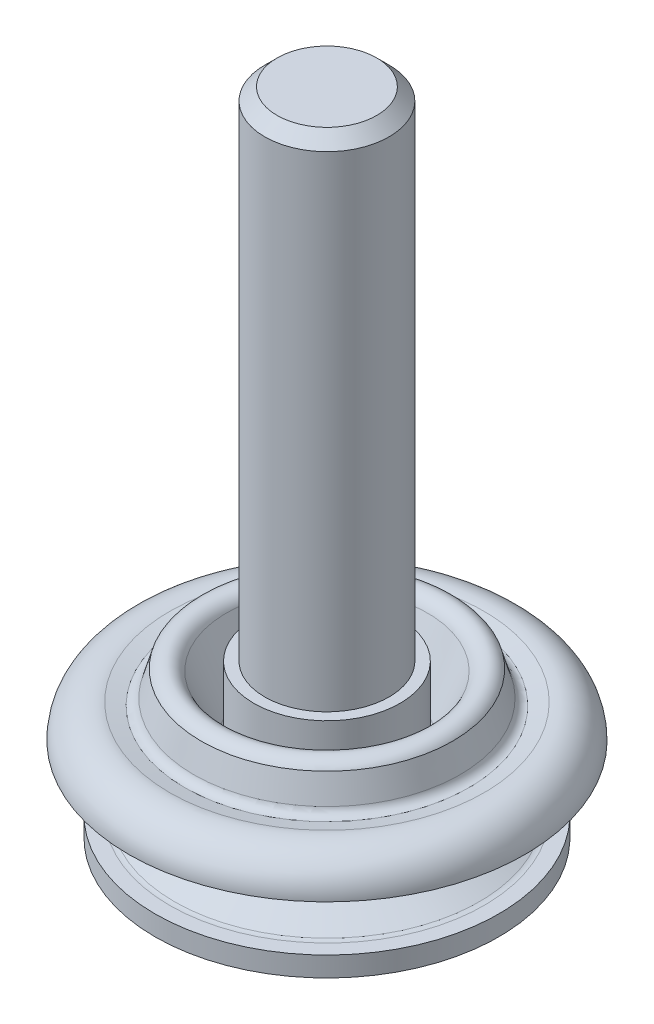
ISO-10303-21;
HEADER;
FILE_DESCRIPTION(('STEP AP214'),'2;1');
FILE_NAME('part.step','',(''),(''),'','','');
FILE_SCHEMA(('AUTOMOTIVE_DESIGN { 1 0 10303 214 1 1 1 1 }'));
ENDSEC;
DATA;
#1=APPLICATION_CONTEXT('core data for automotive mechanical design processes');
#2=APPLICATION_PROTOCOL_DEFINITION('international standard','automotive_design',2000,#1);
#3=PRODUCT_CONTEXT('',#1,'mechanical');
#4=PRODUCT('Part','Part','',(#3));
#5=PRODUCT_RELATED_PRODUCT_CATEGORY('part','',(#4));
#6=PRODUCT_DEFINITION_FORMATION('','',#4);
#7=PRODUCT_DEFINITION_CONTEXT('part definition',#1,'design');
#8=PRODUCT_DEFINITION('design','',#6,#7);
#9=PRODUCT_DEFINITION_SHAPE('','',#8);
#10=(LENGTH_UNIT() NAMED_UNIT(*) SI_UNIT(.MILLI.,.METRE.));
#11=(NAMED_UNIT(*) PLANE_ANGLE_UNIT() SI_UNIT($,.RADIAN.));
#12=(NAMED_UNIT(*) SI_UNIT($,.STERADIAN.) SOLID_ANGLE_UNIT());
#13=UNCERTAINTY_MEASURE_WITH_UNIT(LENGTH_MEASURE(1.E-05),#10,'distance_accuracy_value','');
#14=(GEOMETRIC_REPRESENTATION_CONTEXT(3) GLOBAL_UNCERTAINTY_ASSIGNED_CONTEXT((#13)) GLOBAL_UNIT_ASSIGNED_CONTEXT((#10,
#11,#12)) REPRESENTATION_CONTEXT('',''));
#15=CARTESIAN_POINT('',(0.,0.,0.));
#16=DIRECTION('',(0.,0.,1.));
#17=DIRECTION('',(1.,0.,0.));
#18=AXIS2_PLACEMENT_3D('',#15,#16,#17);
#19=CARTESIAN_POINT('',(-10.8805326439287,24.7146937341376,0.319361058));
#20=DIRECTION('',(0.,-1.,0.));
#21=DIRECTION('',(0.,0.,-1.));
#22=AXIS2_PLACEMENT_3D('',#19,#20,#21);
#23=CONICAL_SURFACE('',#22,4.76577553828,0.56627487324335);
#24=CARTESIAN_POINT('',(-10.8805326439287,23.307110222726,0.319361058));
#25=DIRECTION('',(0.,1.,0.));
#26=DIRECTION('',(0.,0.,1.));
#27=AXIS2_PLACEMENT_3D('',#24,#25,#26);
#28=CIRCLE('',#27,5.66061225);
#29=CARTESIAN_POINT('',(-10.8805326439287,23.307110222726,5.979973308));
#30=VERTEX_POINT('',#29);
#31=EDGE_CURVE('E131',#30,#30,#28,.T.);
#32=ORIENTED_EDGE('',*,*,#31,.T.);
#33=EDGE_LOOP('',(#32));
#34=FACE_BOUND('',#33,.T.);
#35=CARTESIAN_POINT('',(-10.8805326439287,24.7146937341376,0.319361058));
#36=DIRECTION('',(0.,1.,0.));
#37=DIRECTION('',(0.,0.,1.));
#38=AXIS2_PLACEMENT_3D('',#35,#36,#37);
#39=CIRCLE('',#38,4.76577553828);
#40=CARTESIAN_POINT('',(-10.8805326439287,24.7146937341376,5.08513659628));
#41=VERTEX_POINT('',#40);
#42=EDGE_CURVE('E10',#41,#41,#39,.T.);
#43=ORIENTED_EDGE('',*,*,#42,.F.);
#44=EDGE_LOOP('',(#43));
#45=FACE_BOUND('',#44,.T.);
#46=ADVANCED_FACE('F31',(#34,#45),#23,.T.);
#47=CARTESIAN_POINT('',(-10.8805326439287,24.2118454998702,0.319361058));
#48=DIRECTION('',(0.,1.,0.));
#49=DIRECTION('',(0.,0.,1.));
#50=AXIS2_PLACEMENT_3D('',#47,#48,#49);
#51=TOROIDAL_SURFACE('',#50,4.83794155859002,0.508000276764841);
#52=ORIENTED_EDGE('',*,*,#42,.T.);
#53=EDGE_LOOP('',(#52));
#54=FACE_BOUND('',#53,.T.);
#55=CARTESIAN_POINT('',(-10.8805326439287,24.3064292070117,0.319361058));
#56=DIRECTION('',(0.,1.,0.));
#57=DIRECTION('',(0.,0.,1.));
#58=AXIS2_PLACEMENT_3D('',#55,#56,#57);
#59=CIRCLE('',#58,5.33705898318721);
#60=CARTESIAN_POINT('',(-10.8805326439287,24.3064292070117,5.65642004118721));
#61=VERTEX_POINT('',#60);
#62=EDGE_CURVE('E37',#61,#61,#59,.T.);
#63=ORIENTED_EDGE('',*,*,#62,.F.);
#64=EDGE_LOOP('',(#63));
#65=FACE_BOUND('',#64,.T.);
#66=ADVANCED_FACE('F148',(#54,#65),#51,.F.);
#67=CARTESIAN_POINT('',(-10.8805326439287,24.7084096952689,0.319361058));
#68=DIRECTION('',(0.,1.,0.));
#69=DIRECTION('',(0.,0.,1.));
#70=AXIS2_PLACEMENT_3D('',#67,#68,#69);
#71=TOROIDAL_SURFACE('',#70,7.45830662827207,2.15899974171317);
#72=ORIENTED_EDGE('',*,*,#62,.T.);
#73=EDGE_LOOP('',(#72));
#74=FACE_BOUND('',#73,.T.);
#75=CARTESIAN_POINT('',(-10.8805326439287,22.7582847673011,0.319361058));
#76=DIRECTION('',(0.,1.,0.));
#77=DIRECTION('',(0.,0.,1.));
#78=AXIS2_PLACEMENT_3D('',#75,#76,#77);
#79=CIRCLE('',#78,6.53186577746926);
#80=CARTESIAN_POINT('',(-10.8805326439287,22.7582847673011,6.85122683546926));
#81=VERTEX_POINT('',#80);
#82=EDGE_CURVE('E41',#81,#81,#79,.T.);
#83=ORIENTED_EDGE('',*,*,#82,.F.);
#84=EDGE_LOOP('',(#83));
#85=FACE_BOUND('',#84,.T.);
#86=ADVANCED_FACE('F152',(#74,#85),#71,.T.);
#87=CARTESIAN_POINT('',(-10.8805326439287,20.5415673849615,0.319361058));
#88=DIRECTION('',(0.,-1.,0.));
#89=DIRECTION('',(0.,0.,-1.));
#90=AXIS2_PLACEMENT_3D('',#87,#88,#89);
#91=CONICAL_SURFACE('',#90,11.1979767567227,1.12729296950659);
#92=ORIENTED_EDGE('',*,*,#82,.T.);
#93=EDGE_LOOP('',(#92));
#94=FACE_BOUND('',#93,.T.);
#95=CARTESIAN_POINT('',(-10.8805326439287,20.5415673849615,0.319361058));
#96=DIRECTION('',(0.,1.,0.));
#97=DIRECTION('',(0.,0.,1.));
#98=AXIS2_PLACEMENT_3D('',#95,#96,#97);
#99=CIRCLE('',#98,11.1979767567227);
#100=CARTESIAN_POINT('',(-10.8805326439287,20.5415673849615,11.5173378147227));
#101=VERTEX_POINT('',#100);
#102=EDGE_CURVE('E45',#101,#101,#99,.T.);
#103=ORIENTED_EDGE('',*,*,#102,.F.);
#104=EDGE_LOOP('',(#103));
#105=FACE_BOUND('',#104,.T.);
#106=ADVANCED_FACE('F156',(#94,#105),#91,.F.);
#107=CARTESIAN_POINT('',(-10.8805326439287,21.6886998772554,0.319361058));
#108=DIRECTION('',(0.,1.,0.));
#109=DIRECTION('',(0.,0.,1.));
#110=AXIS2_PLACEMENT_3D('',#107,#108,#109);
#111=TOROIDAL_SURFACE('',#110,11.7429420494087,1.27000004925541);
#112=ORIENTED_EDGE('',*,*,#102,.T.);
#113=EDGE_LOOP('',(#112));
#114=FACE_BOUND('',#113,.T.);
#115=CARTESIAN_POINT('',(-10.8805326439287,20.418699828,0.319361058));
#116=DIRECTION('',(0.,1.,0.));
#117=DIRECTION('',(0.,0.,1.));
#118=AXIS2_PLACEMENT_3D('',#115,#116,#117);
#119=CIRCLE('',#118,11.7429420494087);
#120=CARTESIAN_POINT('',(-10.8805326439287,20.418699828,12.0623031074087));
#121=VERTEX_POINT('',#120);
#122=EDGE_CURVE('E50',#121,#121,#119,.T.);
#123=ORIENTED_EDGE('',*,*,#122,.F.);
#124=EDGE_LOOP('',(#123));
#125=FACE_BOUND('',#124,.T.);
#126=ADVANCED_FACE('F162',(#114,#125),#111,.T.);
#127=CARTESIAN_POINT('',(2.280702576,20.418699828,0.319361058));
#128=DIRECTION('',(0.,-1.,0.));
#129=DIRECTION('',(0.,0.,-1.));
#130=AXIS2_PLACEMENT_3D('',#127,#128,#129);
#131=PLANE('',#130);
#132=ORIENTED_EDGE('',*,*,#122,.T.);
#133=EDGE_LOOP('',(#132));
#134=FACE_BOUND('',#133,.T.);
#135=CARTESIAN_POINT('',(-10.8805326439287,20.418699828,0.319361058));
#136=DIRECTION('',(0.,1.,0.));
#137=DIRECTION('',(0.,0.,1.));
#138=AXIS2_PLACEMENT_3D('',#135,#136,#137);
#139=CIRCLE('',#138,13.1612352199287);
#140=CARTESIAN_POINT('',(-10.8805326439287,20.418699828,13.4805962779287));
#141=VERTEX_POINT('',#140);
#142=EDGE_CURVE('E53',#141,#141,#139,.T.);
#143=ORIENTED_EDGE('',*,*,#142,.F.);
#144=EDGE_LOOP('',(#143));
#145=FACE_BOUND('',#144,.T.);
#146=ADVANCED_FACE('F166',(#134,#145),#131,.T.);
#147=CARTESIAN_POINT('',(-10.8805326439287,20.418699692726,0.319361058));
#148=DIRECTION('',(0.,1.,0.));
#149=DIRECTION('',(0.,0.,1.));
#150=AXIS2_PLACEMENT_3D('',#147,#148,#149);
#151=CYLINDRICAL_SURFACE('',#150,13.1612352199287);
#152=ORIENTED_EDGE('',*,*,#142,.T.);
#153=EDGE_LOOP('',(#152));
#154=FACE_BOUND('',#153,.T.);
#155=CARTESIAN_POINT('',(-10.8805326439287,21.9426997152839,0.319361058));
#156=DIRECTION('',(0.,1.,0.));
#157=DIRECTION('',(0.,0.,1.));
#158=AXIS2_PLACEMENT_3D('',#155,#156,#157);
#159=CIRCLE('',#158,13.1612352199287);
#160=CARTESIAN_POINT('',(-10.8805326439287,21.9426997152839,13.4805962779287));
#161=VERTEX_POINT('',#160);
#162=EDGE_CURVE('E56',#161,#161,#159,.T.);
#163=ORIENTED_EDGE('',*,*,#162,.F.);
#164=EDGE_LOOP('',(#163));
#165=FACE_BOUND('',#164,.T.);
#166=ADVANCED_FACE('F170',(#154,#165),#151,.T.);
#167=CARTESIAN_POINT('',(1.15707125177589,21.9426997152839,0.319361058));
#168=DIRECTION('',(0.,1.,0.));
#169=DIRECTION('',(0.,0.,1.));
#170=AXIS2_PLACEMENT_3D('',#167,#168,#169);
#171=PLANE('',#170);
#172=ORIENTED_EDGE('',*,*,#162,.T.);
#173=EDGE_LOOP('',(#172));
#174=FACE_BOUND('',#173,.T.);
#175=CARTESIAN_POINT('',(-10.8805326439287,21.9426997152839,0.319361058));
#176=DIRECTION('',(0.,1.,0.));
#177=DIRECTION('',(0.,0.,1.));
#178=AXIS2_PLACEMENT_3D('',#175,#176,#177);
#179=CIRCLE('',#178,12.0376038957046);
#180=CARTESIAN_POINT('',(-10.8805326439287,21.9426997152839,12.3569649537046));
#181=VERTEX_POINT('',#180);
#182=EDGE_CURVE('E59',#181,#181,#179,.T.);
#183=ORIENTED_EDGE('',*,*,#182,.F.);
#184=EDGE_LOOP('',(#183));
#185=FACE_BOUND('',#184,.T.);
#186=ADVANCED_FACE('F174',(#174,#185),#171,.T.);
#187=CARTESIAN_POINT('',(-10.8805326439287,23.0663356546663,0.319361058));
#188=DIRECTION('',(0.,1.,0.));
#189=DIRECTION('',(0.,0.,1.));
#190=AXIS2_PLACEMENT_3D('',#187,#188,#189);
#191=TOROIDAL_SURFACE('',#190,12.0376038957046,1.12363593938237);
#192=ORIENTED_EDGE('',*,*,#182,.T.);
#193=EDGE_LOOP('',(#192));
#194=FACE_BOUND('',#193,.T.);
#195=CARTESIAN_POINT('',(-10.8805326439287,22.0044664973922,0.319361058));
#196=DIRECTION('',(0.,1.,0.));
#197=DIRECTION('',(0.,0.,1.));
#198=AXIS2_PLACEMENT_3D('',#195,#196,#197);
#199=CIRCLE('',#198,11.6701918421441);
#200=CARTESIAN_POINT('',(-10.8805326439287,22.0044664973922,11.9895529001441));
#201=VERTEX_POINT('',#200);
#202=EDGE_CURVE('E62',#201,#201,#199,.T.);
#203=ORIENTED_EDGE('',*,*,#202,.F.);
#204=EDGE_LOOP('',(#203));
#205=FACE_BOUND('',#204,.T.);
#206=ADVANCED_FACE('F178',(#194,#205),#191,.F.);
#207=CARTESIAN_POINT('',(-10.8805326439287,24.1348438250979,0.319361058));
#208=DIRECTION('',(0.,-1.,0.));
#209=DIRECTION('',(0.,0.,-1.));
#210=AXIS2_PLACEMENT_3D('',#207,#208,#209);
#211=CONICAL_SURFACE('',#210,7.18582412823781,1.12729292355417);
#212=ORIENTED_EDGE('',*,*,#202,.T.);
#213=EDGE_LOOP('',(#212));
#214=FACE_BOUND('',#213,.T.);
#215=CARTESIAN_POINT('',(-10.8805326439287,24.1348438250979,0.319361058));
#216=DIRECTION('',(0.,1.,0.));
#217=DIRECTION('',(0.,0.,1.));
#218=AXIS2_PLACEMENT_3D('',#215,#216,#217);
#219=CIRCLE('',#218,7.18582412823781);
#220=CARTESIAN_POINT('',(-10.8805326439287,24.1348438250979,7.50518518623781));
#221=VERTEX_POINT('',#220);
#222=EDGE_CURVE('E65',#221,#221,#219,.T.);
#223=ORIENTED_EDGE('',*,*,#222,.F.);
#224=EDGE_LOOP('',(#223));
#225=FACE_BOUND('',#224,.T.);
#226=ADVANCED_FACE('F182',(#214,#225),#211,.T.);
#227=CARTESIAN_POINT('',(-10.8805326439287,24.7084096952689,0.319361058));
#228=DIRECTION('',(0.,1.,0.));
#229=DIRECTION('',(0.,0.,1.));
#230=AXIS2_PLACEMENT_3D('',#227,#228,#229);
#231=TOROIDAL_SURFACE('',#230,7.45830662827207,0.634999622243924);
#232=ORIENTED_EDGE('',*,*,#222,.T.);
#233=EDGE_LOOP('',(#232));
#234=FACE_BOUND('',#233,.T.);
#235=CARTESIAN_POINT('',(-10.8805326439287,24.683572405722,0.319361058));
#236=DIRECTION('',(0.,1.,0.));
#237=DIRECTION('',(0.,0.,1.));
#238=AXIS2_PLACEMENT_3D('',#235,#236,#237);
#239=CIRCLE('',#238,6.82379293314966);
#240=CARTESIAN_POINT('',(-10.8805326439287,24.683572405722,7.14315399114966));
#241=VERTEX_POINT('',#240);
#242=EDGE_CURVE('E68',#241,#241,#239,.T.);
#243=ORIENTED_EDGE('',*,*,#242,.F.);
#244=EDGE_LOOP('',(#243));
#245=FACE_BOUND('',#244,.T.);
#246=ADVANCED_FACE('F186',(#234,#245),#231,.F.);
#247=CARTESIAN_POINT('',(-10.8805326439287,25.8471102456008,0.319361058));
#248=DIRECTION('',(0.,-1.,0.));
#249=DIRECTION('',(0.,0.,-1.));
#250=AXIS2_PLACEMENT_3D('',#247,#248,#249);
#251=CONICAL_SURFACE('',#250,6.77824761797366,0.0391238452945353);
#252=ORIENTED_EDGE('',*,*,#242,.T.);
#253=EDGE_LOOP('',(#252));
#254=FACE_BOUND('',#253,.T.);
#255=CARTESIAN_POINT('',(-10.8805326439287,25.8471102456008,0.319361058));
#256=DIRECTION('',(0.,1.,0.));
#257=DIRECTION('',(0.,0.,1.));
#258=AXIS2_PLACEMENT_3D('',#255,#256,#257);
#259=CIRCLE('',#258,6.77824761797366);
#260=CARTESIAN_POINT('',(-10.8805326439287,25.8471102456008,7.09760867597366));
#261=VERTEX_POINT('',#260);
#262=EDGE_CURVE('E71',#261,#261,#259,.T.);
#263=ORIENTED_EDGE('',*,*,#262,.F.);
#264=EDGE_LOOP('',(#263));
#265=FACE_BOUND('',#264,.T.);
#266=ADVANCED_FACE('F190',(#254,#265),#251,.T.);
#267=CARTESIAN_POINT('',(-4.34215699985506,25.8471102456008,0.319361058));
#268=DIRECTION('',(0.,1.,0.));
#269=DIRECTION('',(0.,0.,1.));
#270=AXIS2_PLACEMENT_3D('',#267,#268,#269);
#271=PLANE('',#270);
#272=ORIENTED_EDGE('',*,*,#262,.T.);
#273=EDGE_LOOP('',(#272));
#274=FACE_BOUND('',#273,.T.);
#275=CARTESIAN_POINT('',(-10.8805326439287,25.8471102456008,0.319361058));
#276=DIRECTION('',(0.,1.,0.));
#277=DIRECTION('',(0.,0.,1.));
#278=AXIS2_PLACEMENT_3D('',#275,#276,#277);
#279=CIRCLE('',#278,6.53837564407366);
#280=CARTESIAN_POINT('',(-10.8805326439287,25.8471102456008,6.85773670207366));
#281=VERTEX_POINT('',#280);
#282=EDGE_CURVE('E74',#281,#281,#279,.T.);
#283=ORIENTED_EDGE('',*,*,#282,.F.);
#284=EDGE_LOOP('',(#283));
#285=FACE_BOUND('',#284,.T.);
#286=ADVANCED_FACE('F194',(#274,#285),#271,.T.);
#287=CARTESIAN_POINT('',(-10.8805326439287,26.6862320268872,0.319361058));
#288=DIRECTION('',(0.,1.,0.));
#289=DIRECTION('',(0.,0.,1.));
#290=AXIS2_PLACEMENT_3D('',#287,#288,#289);
#291=TOROIDAL_SURFACE('',#290,6.53837564407366,0.839121781286455);
#292=ORIENTED_EDGE('',*,*,#282,.T.);
#293=EDGE_LOOP('',(#292));
#294=FACE_BOUND('',#293,.T.);
#295=CARTESIAN_POINT('',(-10.8805326439287,26.4527399720672,0.319361058));
#296=DIRECTION('',(0.,1.,0.));
#297=DIRECTION('',(0.,0.,1.));
#298=AXIS2_PLACEMENT_3D('',#295,#296,#297);
#299=CIRCLE('',#298,7.34435754471741);
#300=CARTESIAN_POINT('',(-10.8805326439287,26.4527399720672,7.66371860271741));
#301=VERTEX_POINT('',#300);
#302=EDGE_CURVE('E77',#301,#301,#299,.T.);
#303=ORIENTED_EDGE('',*,*,#302,.F.);
#304=EDGE_LOOP('',(#303));
#305=FACE_BOUND('',#304,.T.);
#306=ADVANCED_FACE('F198',(#294,#305),#291,.T.);
#307=CARTESIAN_POINT('',(-10.8805326439287,29.9640687380672,0.319361058));
#308=DIRECTION('',(0.,1.,0.));
#309=DIRECTION('',(0.,0.,1.));
#310=AXIS2_PLACEMENT_3D('',#307,#308,#309);
#311=CONICAL_SURFACE('',#310,8.7084124747174,0.370529614748452);
#312=ORIENTED_EDGE('',*,*,#302,.T.);
#313=EDGE_LOOP('',(#312));
#314=FACE_BOUND('',#313,.T.);
#315=CARTESIAN_POINT('',(-10.8805326439287,29.9640687380672,0.319361058));
#316=DIRECTION('',(0.,1.,0.));
#317=DIRECTION('',(0.,0.,1.));
#318=AXIS2_PLACEMENT_3D('',#315,#316,#317);
#319=CIRCLE('',#318,8.7084124747174);
#320=CARTESIAN_POINT('',(-10.8805326439287,29.9640687380672,9.0277735327174));
#321=VERTEX_POINT('',#320);
#322=EDGE_CURVE('E80',#321,#321,#319,.T.);
#323=ORIENTED_EDGE('',*,*,#322,.F.);
#324=EDGE_LOOP('',(#323));
#325=FACE_BOUND('',#324,.T.);
#326=ADVANCED_FACE('F202',(#314,#325),#311,.T.);
#327=CARTESIAN_POINT('',(-10.8805326439287,27.4936238597352,0.319361058));
#328=DIRECTION('',(0.,-1.,0.));
#329=DIRECTION('',(0.,0.,-1.));
#330=AXIS2_PLACEMENT_3D('',#327,#328,#329);
#331=CONICAL_SURFACE('',#330,9.91072273760632,0.452933024843341);
#332=ORIENTED_EDGE('',*,*,#322,.T.);
#333=EDGE_LOOP('',(#332));
#334=FACE_BOUND('',#333,.T.);
#335=CARTESIAN_POINT('',(-10.8805326439287,27.4936238597352,0.319361058));
#336=DIRECTION('',(0.,1.,0.));
#337=DIRECTION('',(0.,0.,1.));
#338=AXIS2_PLACEMENT_3D('',#335,#336,#337);
#339=CIRCLE('',#338,9.91072273760632);
#340=CARTESIAN_POINT('',(-10.8805326439287,27.4936238597352,10.2300837956063));
#341=VERTEX_POINT('',#340);
#342=EDGE_CURVE('E83',#341,#341,#339,.T.);
#343=ORIENTED_EDGE('',*,*,#342,.F.);
#344=EDGE_LOOP('',(#343));
#345=FACE_BOUND('',#344,.T.);
#346=ADVANCED_FACE('F206',(#334,#345),#331,.F.);
#347=CARTESIAN_POINT('',(-10.8805326439287,27.964594726729,0.319361058));
#348=DIRECTION('',(0.,1.,0.));
#349=DIRECTION('',(0.,0.,1.));
#350=AXIS2_PLACEMENT_3D('',#347,#348,#349);
#351=TOROIDAL_SURFACE('',#350,10.8784492904953,1.07624729440931);
#352=ORIENTED_EDGE('',*,*,#342,.T.);
#353=EDGE_LOOP('',(#352));
#354=FACE_BOUND('',#353,.T.);
#355=CARTESIAN_POINT('',(-10.8805326439287,26.8883474323197,0.319361058));
#356=DIRECTION('',(0.,1.,0.));
#357=DIRECTION('',(0.,0.,1.));
#358=AXIS2_PLACEMENT_3D('',#355,#356,#357);
#359=CIRCLE('',#358,10.8784492904953);
#360=CARTESIAN_POINT('',(-10.8805326439287,26.8883474323197,11.1978103484953));
#361=VERTEX_POINT('',#360);
#362=EDGE_CURVE('E86',#361,#361,#359,.T.);
#363=ORIENTED_EDGE('',*,*,#362,.F.);
#364=EDGE_LOOP('',(#363));
#365=FACE_BOUND('',#364,.T.);
#366=ADVANCED_FACE('F210',(#354,#365),#351,.T.);
#367=CARTESIAN_POINT('',(0.633106597926597,26.8883474323197,0.319361058));
#368=DIRECTION('',(0.,-1.,0.));
#369=DIRECTION('',(0.,0.,-1.));
#370=AXIS2_PLACEMENT_3D('',#367,#368,#369);
#371=PLANE('',#370);
#372=ORIENTED_EDGE('',*,*,#362,.T.);
#373=EDGE_LOOP('',(#372));
#374=FACE_BOUND('',#373,.T.);
#375=CARTESIAN_POINT('',(-10.8805326439287,26.8883474323197,0.319361058));
#376=DIRECTION('',(0.,1.,0.));
#377=DIRECTION('',(0.,0.,1.));
#378=AXIS2_PLACEMENT_3D('',#375,#376,#377);
#379=CIRCLE('',#378,11.5136392418553);
#380=CARTESIAN_POINT('',(-10.8805326439287,26.8883474323197,11.8330002998553));
#381=VERTEX_POINT('',#380);
#382=EDGE_CURVE('E89',#381,#381,#379,.T.);
#383=ORIENTED_EDGE('',*,*,#382,.F.);
#384=EDGE_LOOP('',(#383));
#385=FACE_BOUND('',#384,.T.);
#386=ADVANCED_FACE('F214',(#374,#385),#371,.T.);
#387=CARTESIAN_POINT('',(-10.8805326439287,26.8883474323197,0.319361058));
#388=DIRECTION('',(0.,1.,0.));
#389=DIRECTION('',(0.,0.,1.));
#390=AXIS2_PLACEMENT_3D('',#387,#388,#389);
#391=TOROIDAL_SURFACE('',#390,12.5804392418553,1.06680000000001);
#392=ORIENTED_EDGE('',*,*,#382,.T.);
#393=EDGE_LOOP('',(#392));
#394=FACE_BOUND('',#393,.T.);
#395=CARTESIAN_POINT('',(-10.8805326439287,26.8883474323197,0.319361058));
#396=DIRECTION('',(0.,1.,0.));
#397=DIRECTION('',(0.,0.,1.));
#398=AXIS2_PLACEMENT_3D('',#395,#396,#397);
#399=CIRCLE('',#398,13.6472392418553);
#400=CARTESIAN_POINT('',(-10.8805326439287,26.8883474323197,13.9666002998553));
#401=VERTEX_POINT('',#400);
#402=EDGE_CURVE('E92',#401,#401,#399,.T.);
#403=ORIENTED_EDGE('',*,*,#402,.F.);
#404=EDGE_LOOP('',(#403));
#405=FACE_BOUND('',#404,.T.);
#406=ADVANCED_FACE('F218',(#394,#405),#391,.T.);
#407=CARTESIAN_POINT('',(4.29070663023746,26.8883474323197,0.319361058));
#408=DIRECTION('',(0.,-1.,0.));
#409=DIRECTION('',(0.,0.,-1.));
#410=AXIS2_PLACEMENT_3D('',#407,#408,#409);
#411=PLANE('',#410);
#412=ORIENTED_EDGE('',*,*,#402,.T.);
#413=EDGE_LOOP('',(#412));
#414=FACE_BOUND('',#413,.T.);
#415=CARTESIAN_POINT('',(-10.8805326439287,26.8883474323197,0.319361058));
#416=DIRECTION('',(0.,1.,0.));
#417=DIRECTION('',(0.,0.,1.));
#418=AXIS2_PLACEMENT_3D('',#415,#416,#417);
#419=CIRCLE('',#418,15.1712392741662);
#420=CARTESIAN_POINT('',(-10.8805326439287,26.8883474323197,15.4906003321662));
#421=VERTEX_POINT('',#420);
#422=EDGE_CURVE('E95',#421,#421,#419,.T.);
#423=ORIENTED_EDGE('',*,*,#422,.F.);
#424=EDGE_LOOP('',(#423));
#425=FACE_BOUND('',#424,.T.);
#426=ADVANCED_FACE('F222',(#414,#425),#411,.T.);
#427=CARTESIAN_POINT('',(-10.8805326439287,26.8883474323197,0.319361058));
#428=DIRECTION('',(0.,1.,0.));
#429=DIRECTION('',(0.,0.,1.));
#430=AXIS2_PLACEMENT_3D('',#427,#428,#429);
#431=TOROIDAL_SURFACE('',#430,12.5804392418553,2.59080003231086);
#432=ORIENTED_EDGE('',*,*,#422,.T.);
#433=EDGE_LOOP('',(#432));
#434=FACE_BOUND('',#433,.T.);
#435=CARTESIAN_POINT('',(-10.8805326439287,29.4216402722005,0.319361058));
#436=DIRECTION('',(0.,1.,0.));
#437=DIRECTION('',(0.,0.,1.));
#438=AXIS2_PLACEMENT_3D('',#435,#436,#437);
#439=CIRCLE('',#438,12.037602070292);
#440=CARTESIAN_POINT('',(-10.8805326439287,29.4216402722005,12.356963128292));
#441=VERTEX_POINT('',#440);
#442=EDGE_CURVE('E98',#441,#441,#439,.T.);
#443=ORIENTED_EDGE('',*,*,#442,.F.);
#444=EDGE_LOOP('',(#443));
#445=FACE_BOUND('',#444,.T.);
#446=ADVANCED_FACE('F226',(#434,#445),#431,.T.);
#447=CARTESIAN_POINT('',(-10.8805326439287,29.1732558859908,0.319361058));
#448=DIRECTION('',(0.,1.,0.));
#449=DIRECTION('',(0.,0.,1.));
#450=AXIS2_PLACEMENT_3D('',#447,#448,#449);
#451=CONICAL_SURFACE('',#450,10.8784508181567,1.35970725612542);
#452=ORIENTED_EDGE('',*,*,#442,.T.);
#453=EDGE_LOOP('',(#452));
#454=FACE_BOUND('',#453,.T.);
#455=CARTESIAN_POINT('',(-10.8805326439287,29.1732558859908,0.319361058));
#456=DIRECTION('',(0.,1.,0.));
#457=DIRECTION('',(0.,0.,1.));
#458=AXIS2_PLACEMENT_3D('',#455,#456,#457);
#459=CIRCLE('',#458,10.8784508181567);
#460=CARTESIAN_POINT('',(-10.8805326439287,29.1732558859908,11.1978118761567));
#461=VERTEX_POINT('',#460);
#462=EDGE_CURVE('E101',#461,#461,#459,.T.);
#463=ORIENTED_EDGE('',*,*,#462,.F.);
#464=EDGE_LOOP('',(#463));
#465=FACE_BOUND('',#464,.T.);
#466=ADVANCED_FACE('F230',(#454,#465),#451,.F.);
#467=CARTESIAN_POINT('',(-10.8805326439287,29.8881040058945,0.319361058));
#468=DIRECTION('',(0.,1.,0.));
#469=DIRECTION('',(0.,0.,1.));
#470=AXIS2_PLACEMENT_3D('',#467,#468,#469);
#471=TOROIDAL_SURFACE('',#470,10.8784520995867,0.714848119904817);
#472=ORIENTED_EDGE('',*,*,#462,.T.);
#473=EDGE_LOOP('',(#472));
#474=FACE_BOUND('',#473,.T.);
#475=CARTESIAN_POINT('',(-10.8805326439287,29.6890813528069,0.319361058));
#476=DIRECTION('',(0.,1.,0.));
#477=DIRECTION('',(0.,0.,1.));
#478=AXIS2_PLACEMENT_3D('',#475,#476,#477);
#479=CIRCLE('',#478,10.1918679327947);
#480=CARTESIAN_POINT('',(-10.8805326439287,29.6890813528069,10.5112289907947));
#481=VERTEX_POINT('',#480);
#482=EDGE_CURVE('E104',#481,#481,#479,.T.);
#483=ORIENTED_EDGE('',*,*,#482,.F.);
#484=EDGE_LOOP('',(#483));
#485=FACE_BOUND('',#484,.T.);
#486=ADVANCED_FACE('F234',(#474,#485),#471,.F.);
#487=CARTESIAN_POINT('',(-10.8805326439287,31.6345984361485,0.319361058));
#488=DIRECTION('',(0.,-1.,0.));
#489=DIRECTION('',(0.,0.,-1.));
#490=AXIS2_PLACEMENT_3D('',#487,#488,#489);
#491=CONICAL_SURFACE('',#490,9.62791380993305,0.282140862535205);
#492=ORIENTED_EDGE('',*,*,#482,.T.);
#493=EDGE_LOOP('',(#492));
#494=FACE_BOUND('',#493,.T.);
#495=CARTESIAN_POINT('',(-10.8805326439287,31.6345984361485,0.319361058));
#496=DIRECTION('',(0.,1.,0.));
#497=DIRECTION('',(0.,0.,1.));
#498=AXIS2_PLACEMENT_3D('',#495,#496,#497);
#499=CIRCLE('',#498,9.62791380993305);
#500=CARTESIAN_POINT('',(-10.8805326439287,31.6345984361485,9.94727486793305));
#501=VERTEX_POINT('',#500);
#502=EDGE_CURVE('E107',#501,#501,#499,.T.);
#503=ORIENTED_EDGE('',*,*,#502,.F.);
#504=EDGE_LOOP('',(#503));
#505=FACE_BOUND('',#504,.T.);
#506=ADVANCED_FACE('F238',(#494,#505),#491,.T.);
#507=CARTESIAN_POINT('',(-10.8805326439287,31.0369476348151,0.319361058));
#508=DIRECTION('',(0.,1.,0.));
#509=DIRECTION('',(0.,0.,1.));
#510=AXIS2_PLACEMENT_3D('',#507,#508,#509);
#511=TOROIDAL_SURFACE('',#510,8.70841247691312,1.09666274750258);
#512=ORIENTED_EDGE('',*,*,#502,.T.);
#513=EDGE_LOOP('',(#512));
#514=FACE_BOUND('',#513,.T.);
#515=CARTESIAN_POINT('',(-10.8805326439287,31.4737581261676,0.319361058));
#516=DIRECTION('',(0.,1.,0.));
#517=DIRECTION('',(0.,0.,1.));
#518=AXIS2_PLACEMENT_3D('',#515,#516,#517);
#519=CIRCLE('',#518,7.70249708464382);
#520=CARTESIAN_POINT('',(-10.8805326439287,31.4737581261676,8.02185814264382));
#521=VERTEX_POINT('',#520);
#522=EDGE_CURVE('E110',#521,#521,#519,.T.);
#523=ORIENTED_EDGE('',*,*,#522,.F.);
#524=EDGE_LOOP('',(#523));
#525=FACE_BOUND('',#524,.T.);
#526=ADVANCED_FACE('F242',(#514,#525),#511,.T.);
#527=CARTESIAN_POINT('',(-10.8805326439287,27.1732909574143,0.319361058));
#528=DIRECTION('',(0.,1.,0.));
#529=DIRECTION('',(0.,0.,1.));
#530=AXIS2_PLACEMENT_3D('',#527,#528,#529);
#531=CONICAL_SURFACE('',#530,5.83505456267324,0.409672404953329);
#532=ORIENTED_EDGE('',*,*,#522,.T.);
#533=EDGE_LOOP('',(#532));
#534=FACE_BOUND('',#533,.T.);
#535=CARTESIAN_POINT('',(-10.8805326439287,27.1732909574143,0.319361058));
#536=DIRECTION('',(0.,1.,0.));
#537=DIRECTION('',(0.,0.,1.));
#538=AXIS2_PLACEMENT_3D('',#535,#536,#537);
#539=CIRCLE('',#538,5.83505456267324);
#540=CARTESIAN_POINT('',(-10.8805326439287,27.1732909574143,6.15441562067324));
#541=VERTEX_POINT('',#540);
#542=EDGE_CURVE('E113',#541,#541,#539,.T.);
#543=ORIENTED_EDGE('',*,*,#542,.F.);
#544=EDGE_LOOP('',(#543));
#545=FACE_BOUND('',#544,.T.);
#546=ADVANCED_FACE('F246',(#534,#545),#531,.F.);
#547=CARTESIAN_POINT('',(-10.8805326439287,27.2744611048861,0.319361058));
#548=DIRECTION('',(0.,1.,0.));
#549=DIRECTION('',(0.,0.,1.));
#550=AXIS2_PLACEMENT_3D('',#547,#548,#549);
#551=TOROIDAL_SURFACE('',#550,5.60207341731441,0.253999237857479);
#552=ORIENTED_EDGE('',*,*,#542,.T.);
#553=EDGE_LOOP('',(#552));
#554=FACE_BOUND('',#553,.T.);
#555=CARTESIAN_POINT('',(-10.8805326439287,27.0204618670286,0.319361058));
#556=DIRECTION('',(0.,1.,0.));
#557=DIRECTION('',(0.,0.,1.));
#558=AXIS2_PLACEMENT_3D('',#555,#556,#557);
#559=CIRCLE('',#558,5.60207341731441);
#560=CARTESIAN_POINT('',(-10.8805326439287,27.0204618670286,5.92143447531441));
#561=VERTEX_POINT('',#560);
#562=EDGE_CURVE('E116',#561,#561,#559,.T.);
#563=ORIENTED_EDGE('',*,*,#562,.F.);
#564=EDGE_LOOP('',(#563));
#565=FACE_BOUND('',#564,.T.);
#566=ADVANCED_FACE('F250',(#554,#565),#551,.F.);
#567=CARTESIAN_POINT('',(-10.8805326439287,20.418699692726,0.319361058));
#568=DIRECTION('',(0.,1.,0.));
#569=DIRECTION('',(0.,0.,1.));
#570=AXIS2_PLACEMENT_3D('',#567,#568,#569);
#571=CYLINDRICAL_SURFACE('',#570,5.60207341731441);
#572=ORIENTED_EDGE('',*,*,#562,.T.);
#573=EDGE_LOOP('',(#572));
#574=FACE_BOUND('',#573,.T.);
#575=CARTESIAN_POINT('',(-10.8805326439287,32.1332425997687,0.319361058));
#576=DIRECTION('',(0.,1.,0.));
#577=DIRECTION('',(0.,0.,1.));
#578=AXIS2_PLACEMENT_3D('',#575,#576,#577);
#579=CIRCLE('',#578,5.60207341731441);
#580=CARTESIAN_POINT('',(-10.8805326439287,32.1332425997687,5.92143447531441));
#581=VERTEX_POINT('',#580);
#582=EDGE_CURVE('E119',#581,#581,#579,.T.);
#583=ORIENTED_EDGE('',*,*,#582,.F.);
#584=EDGE_LOOP('',(#583));
#585=FACE_BOUND('',#584,.T.);
#586=ADVANCED_FACE('F254',(#574,#585),#571,.T.);
#587=CARTESIAN_POINT('',(-6.1180318426143,32.1332425997687,0.319361058));
#588=DIRECTION('',(0.,1.,0.));
#589=DIRECTION('',(0.,0.,1.));
#590=AXIS2_PLACEMENT_3D('',#587,#588,#589);
#591=PLANE('',#590);
#592=ORIENTED_EDGE('',*,*,#582,.T.);
#593=EDGE_LOOP('',(#592));
#594=FACE_BOUND('',#593,.T.);
#595=CARTESIAN_POINT('',(-10.8805326439287,32.1332425997687,0.319361058));
#596=DIRECTION('',(0.,1.,0.));
#597=DIRECTION('',(0.,0.,1.));
#598=AXIS2_PLACEMENT_3D('',#595,#596,#597);
#599=CIRCLE('',#598,4.76250080131441);
#600=CARTESIAN_POINT('',(-10.8805326439287,32.1332425997687,5.08186185931442));
#601=VERTEX_POINT('',#600);
#602=EDGE_CURVE('E122',#601,#601,#599,.T.);
#603=ORIENTED_EDGE('',*,*,#602,.F.);
#604=EDGE_LOOP('',(#603));
#605=FACE_BOUND('',#604,.T.);
#606=ADVANCED_FACE('F258',(#594,#605),#591,.T.);
#607=CARTESIAN_POINT('',(-10.8805326439287,20.418699692726,0.319361058));
#608=DIRECTION('',(0.,1.,0.));
#609=DIRECTION('',(0.,0.,1.));
#610=AXIS2_PLACEMENT_3D('',#607,#608,#609);
#611=CYLINDRICAL_SURFACE('',#610,4.76250080131442);
#612=ORIENTED_EDGE('',*,*,#602,.T.);
#613=EDGE_LOOP('',(#612));
#614=FACE_BOUND('',#613,.T.);
#615=CARTESIAN_POINT('',(-10.8805326439287,69.2870936157688,0.319361058));
#616=DIRECTION('',(0.,1.,0.));
#617=DIRECTION('',(0.,0.,1.));
#618=AXIS2_PLACEMENT_3D('',#615,#616,#617);
#619=CIRCLE('',#618,4.76250080131442);
#620=CARTESIAN_POINT('',(-10.8805326439287,69.2870936157688,5.08186185931442));
#621=VERTEX_POINT('',#620);
#622=EDGE_CURVE('E125',#621,#621,#619,.T.);
#623=ORIENTED_EDGE('',*,*,#622,.F.);
#624=EDGE_LOOP('',(#623));
#625=FACE_BOUND('',#624,.T.);
#626=ADVANCED_FACE('F262',(#614,#625),#611,.T.);
#627=CARTESIAN_POINT('',(-10.8805326439287,70.2332438697687,0.319361058));
#628=DIRECTION('',(0.,-1.,0.));
#629=DIRECTION('',(0.,0.,-1.));
#630=AXIS2_PLACEMENT_3D('',#627,#628,#629);
#631=CONICAL_SURFACE('',#630,3.81635054731443,0.785398163397448);
#632=ORIENTED_EDGE('',*,*,#622,.T.);
#633=EDGE_LOOP('',(#632));
#634=FACE_BOUND('',#633,.T.);
#635=CARTESIAN_POINT('',(-10.8805326439287,70.2332438697687,0.319361058));
#636=DIRECTION('',(0.,1.,0.));
#637=DIRECTION('',(0.,0.,1.));
#638=AXIS2_PLACEMENT_3D('',#635,#636,#637);
#639=CIRCLE('',#638,3.81635054731443);
#640=CARTESIAN_POINT('',(-10.8805326439287,70.2332438697687,4.13571160531443));
#641=VERTEX_POINT('',#640);
#642=EDGE_CURVE('E128',#641,#641,#639,.T.);
#643=ORIENTED_EDGE('',*,*,#642,.F.);
#644=EDGE_LOOP('',(#643));
#645=FACE_BOUND('',#644,.T.);
#646=ADVANCED_FACE('F144',(#634,#645),#631,.T.);
#647=CARTESIAN_POINT('',(-10.8805326439287,70.2332438697687,0.319361058));
#648=DIRECTION('',(0.,1.,0.));
#649=DIRECTION('',(0.,0.,1.));
#650=AXIS2_PLACEMENT_3D('',#647,#648,#649);
#651=PLANE('',#650);
#652=ORIENTED_EDGE('',*,*,#642,.T.);
#653=EDGE_LOOP('',(#652));
#654=FACE_BOUND('',#653,.T.);
#655=ADVANCED_FACE('F139',(#654),#651,.T.);
#656=CARTESIAN_POINT('',(-5.21992039392872,23.307110222726,0.319361058));
#657=DIRECTION('',(0.,-1.,0.));
#658=DIRECTION('',(0.,0.,-1.));
#659=AXIS2_PLACEMENT_3D('',#656,#657,#658);
#660=PLANE('',#659);
#661=ORIENTED_EDGE('',*,*,#31,.F.);
#662=EDGE_LOOP('',(#661));
#663=FACE_BOUND('',#662,.T.);
#664=ADVANCED_FACE('F137',(#663),#660,.T.);
#665=CLOSED_SHELL('',(#46,#66,#86,#106,#126,#146,#166,#186,#206,#226,#246,#266,#286,#306,#326,
#346,#366,#386,#406,#426,#446,#466,#486,#506,#526,#546,#566,#586,#606,#626,#646,#655,#664));
#666=MANIFOLD_SOLID_BREP('B2',#665);
#667=ADVANCED_BREP_SHAPE_REPRESENTATION('',(#18,#666),#14);
#668=SHAPE_DEFINITION_REPRESENTATION(#9,#667);
ENDSEC;
END-ISO-10303-21;
